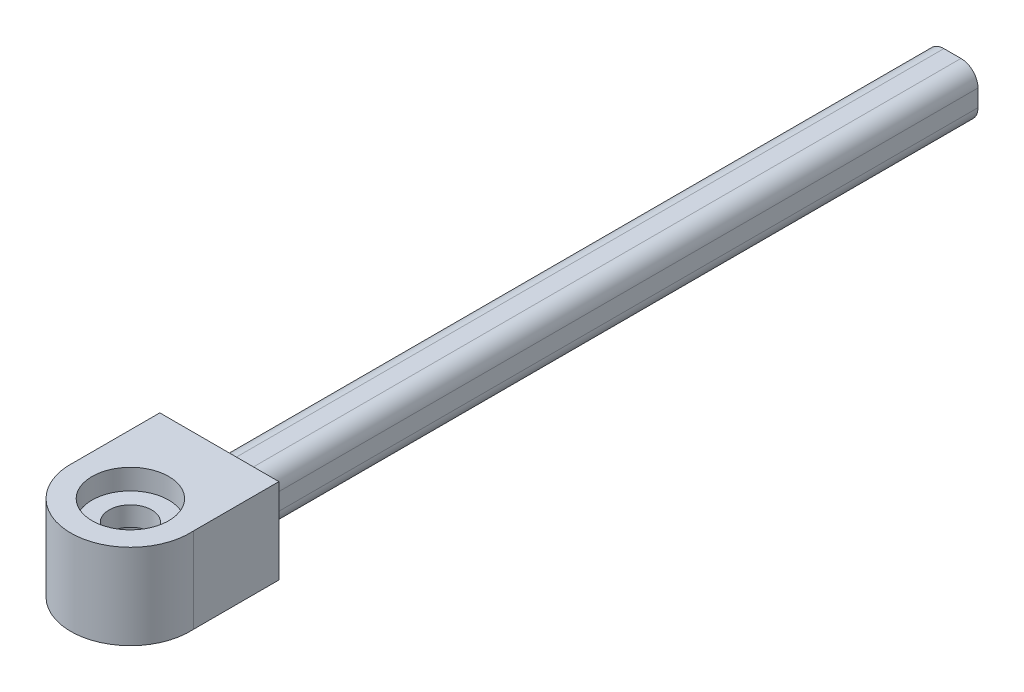
ISO-10303-21;
HEADER;
FILE_DESCRIPTION(('STEP AP214'),'2;1');
FILE_NAME('part.step','',(''),(''),'','','');
FILE_SCHEMA(('AUTOMOTIVE_DESIGN { 1 0 10303 214 1 1 1 1 }'));
ENDSEC;
DATA;
#1=APPLICATION_CONTEXT('core data for automotive mechanical design processes');
#2=APPLICATION_PROTOCOL_DEFINITION('international standard','automotive_design',2000,#1);
#3=PRODUCT_CONTEXT('',#1,'mechanical');
#4=PRODUCT('Part','Part','',(#3));
#5=PRODUCT_RELATED_PRODUCT_CATEGORY('part','',(#4));
#6=PRODUCT_DEFINITION_FORMATION('','',#4);
#7=PRODUCT_DEFINITION_CONTEXT('part definition',#1,'design');
#8=PRODUCT_DEFINITION('design','',#6,#7);
#9=PRODUCT_DEFINITION_SHAPE('','',#8);
#10=(LENGTH_UNIT() NAMED_UNIT(*) SI_UNIT(.MILLI.,.METRE.));
#11=(NAMED_UNIT(*) PLANE_ANGLE_UNIT() SI_UNIT($,.RADIAN.));
#12=(NAMED_UNIT(*) SI_UNIT($,.STERADIAN.) SOLID_ANGLE_UNIT());
#13=UNCERTAINTY_MEASURE_WITH_UNIT(LENGTH_MEASURE(1.E-05),#10,'distance_accuracy_value','');
#14=(GEOMETRIC_REPRESENTATION_CONTEXT(3) GLOBAL_UNCERTAINTY_ASSIGNED_CONTEXT((#13)) GLOBAL_UNIT_ASSIGNED_CONTEXT((#10,
#11,#12)) REPRESENTATION_CONTEXT('',''));
#15=CARTESIAN_POINT('',(0.,0.,0.));
#16=DIRECTION('',(0.,0.,1.));
#17=DIRECTION('',(1.,0.,0.));
#18=AXIS2_PLACEMENT_3D('',#15,#16,#17);
#19=CARTESIAN_POINT('',(3.49315737370935,-8.59119280135186,-5.21875));
#20=DIRECTION('',(0.,0.,1.));
#21=DIRECTION('',(1.,0.,0.));
#22=AXIS2_PLACEMENT_3D('',#19,#20,#21);
#23=PLANE('',#22);
#24=DIRECTION('',(0.,1.,0.));
#25=VECTOR('',#24,1.);
#26=CARTESIAN_POINT('',(3.49315737370935,-8.59119280135186,-5.21875));
#27=LINE('',#26,#25);
#28=CARTESIAN_POINT('',(3.49315737370935,0.,-5.21875));
#29=VERTEX_POINT('',#28);
#30=CARTESIAN_POINT('',(3.49315737370935,5.,-5.21875));
#31=VERTEX_POINT('',#30);
#32=EDGE_CURVE('E123',#29,#31,#27,.T.);
#33=ORIENTED_EDGE('',*,*,#32,.F.);
#34=DIRECTION('',(-1.,0.,0.));
#35=VECTOR('',#34,1.);
#36=CARTESIAN_POINT('',(3.49315737370935,0.,-5.21875));
#37=LINE('',#36,#35);
#38=CARTESIAN_POINT('',(-3.49315737370935,0.,-5.21875));
#39=VERTEX_POINT('',#38);
#40=EDGE_CURVE('E155',#29,#39,#37,.T.);
#41=ORIENTED_EDGE('',*,*,#40,.T.);
#42=DIRECTION('',(0.,1.,0.));
#43=VECTOR('',#42,1.);
#44=CARTESIAN_POINT('',(-3.49315737370935,-8.59119280135186,-5.21875));
#45=LINE('',#44,#43);
#46=CARTESIAN_POINT('',(-3.49315737370935,5.,-5.21875));
#47=VERTEX_POINT('',#46);
#48=EDGE_CURVE('E133',#39,#47,#45,.T.);
#49=ORIENTED_EDGE('',*,*,#48,.T.);
#50=DIRECTION('',(-1.,0.,0.));
#51=VECTOR('',#50,1.);
#52=CARTESIAN_POINT('',(3.49315737370935,5.,-5.21875));
#53=LINE('',#52,#51);
#54=EDGE_CURVE('E141',#31,#47,#53,.T.);
#55=ORIENTED_EDGE('',*,*,#54,.F.);
#56=EDGE_LOOP('',(#33,#41,#49,#55));
#57=FACE_BOUND('',#56,.T.);
#58=DIRECTION('',(0.,1.,0.));
#59=VECTOR('',#58,1.);
#60=CARTESIAN_POINT('',(-1.5,3.5,-5.21875));
#61=LINE('',#60,#59);
#62=CARTESIAN_POINT('',(-1.5,1.5,-5.21875));
#63=VERTEX_POINT('',#62);
#64=CARTESIAN_POINT('',(-1.5,2.5,-5.21875));
#65=VERTEX_POINT('',#64);
#66=EDGE_CURVE('E215',#63,#65,#61,.T.);
#67=ORIENTED_EDGE('',*,*,#66,.F.);
#68=CARTESIAN_POINT('',(-0.5,1.5,-5.21875));
#69=DIRECTION('',(0.,0.,1.));
#70=DIRECTION('',(1.,0.,0.));
#71=AXIS2_PLACEMENT_3D('',#68,#69,#70);
#72=CIRCLE('',#71,1.);
#73=CARTESIAN_POINT('',(-0.5,0.500000000000001,-5.21875));
#74=VERTEX_POINT('',#73);
#75=EDGE_CURVE('E212',#63,#74,#72,.T.);
#76=ORIENTED_EDGE('',*,*,#75,.T.);
#77=DIRECTION('',(-1.,0.,0.));
#78=VECTOR('',#77,1.);
#79=CARTESIAN_POINT('',(1.5,0.500000000000001,-5.21875));
#80=LINE('',#79,#78);
#81=CARTESIAN_POINT('',(0.5,0.500000000000001,-5.21875));
#82=VERTEX_POINT('',#81);
#83=EDGE_CURVE('E146',#82,#74,#80,.T.);
#84=ORIENTED_EDGE('',*,*,#83,.F.);
#85=CARTESIAN_POINT('',(0.5,1.5,-5.21875));
#86=DIRECTION('',(0.,0.,1.));
#87=DIRECTION('',(1.,0.,0.));
#88=AXIS2_PLACEMENT_3D('',#85,#86,#87);
#89=CIRCLE('',#88,1.);
#90=CARTESIAN_POINT('',(1.5,1.5,-5.21875));
#91=VERTEX_POINT('',#90);
#92=EDGE_CURVE('E210',#82,#91,#89,.T.);
#93=ORIENTED_EDGE('',*,*,#92,.T.);
#94=DIRECTION('',(0.,-1.,0.));
#95=VECTOR('',#94,1.);
#96=CARTESIAN_POINT('',(1.5,3.5,-5.21875));
#97=LINE('',#96,#95);
#98=CARTESIAN_POINT('',(1.5,2.5,-5.21875));
#99=VERTEX_POINT('',#98);
#100=EDGE_CURVE('E245',#99,#91,#97,.T.);
#101=ORIENTED_EDGE('',*,*,#100,.F.);
#102=CARTESIAN_POINT('',(0.5,2.5,-5.21875));
#103=DIRECTION('',(0.,0.,1.));
#104=DIRECTION('',(1.,0.,0.));
#105=AXIS2_PLACEMENT_3D('',#102,#103,#104);
#106=CIRCLE('',#105,1.);
#107=CARTESIAN_POINT('',(0.5,3.5,-5.21875));
#108=VERTEX_POINT('',#107);
#109=EDGE_CURVE('E11',#99,#108,#106,.T.);
#110=ORIENTED_EDGE('',*,*,#109,.T.);
#111=DIRECTION('',(1.,0.,0.));
#112=VECTOR('',#111,1.);
#113=CARTESIAN_POINT('',(1.5,3.5,-5.21875));
#114=LINE('',#113,#112);
#115=CARTESIAN_POINT('',(-0.5,3.5,-5.21875));
#116=VERTEX_POINT('',#115);
#117=EDGE_CURVE('E216',#116,#108,#114,.T.);
#118=ORIENTED_EDGE('',*,*,#117,.F.);
#119=CARTESIAN_POINT('',(-0.5,2.5,-5.21875));
#120=DIRECTION('',(0.,0.,1.));
#121=DIRECTION('',(1.,0.,0.));
#122=AXIS2_PLACEMENT_3D('',#119,#120,#121);
#123=CIRCLE('',#122,1.);
#124=EDGE_CURVE('E42',#116,#65,#123,.T.);
#125=ORIENTED_EDGE('',*,*,#124,.T.);
#126=EDGE_LOOP('',(#67,#76,#84,#93,#101,#110,#118,#125));
#127=FACE_BOUND('',#126,.T.);
#128=ADVANCED_FACE('F34',(#57,#127),#23,.F.);
#129=CARTESIAN_POINT('',(0.,0.,0.));
#130=DIRECTION('',(0.,-1.,0.));
#131=DIRECTION('',(0.,0.,-1.));
#132=AXIS2_PLACEMENT_3D('',#129,#130,#131);
#133=CYLINDRICAL_SURFACE('',#132,3.5);
#134=CARTESIAN_POINT('',(0.,5.,0.));
#135=DIRECTION('',(0.,-1.,0.));
#136=DIRECTION('',(0.,0.,-1.));
#137=AXIS2_PLACEMENT_3D('',#134,#135,#136);
#138=CIRCLE('',#137,3.5);
#139=CARTESIAN_POINT('',(3.49315737370935,5.,-0.21875));
#140=VERTEX_POINT('',#139);
#141=CARTESIAN_POINT('',(-3.49315737370935,5.,-0.218749999999998));
#142=VERTEX_POINT('',#141);
#143=EDGE_CURVE('E144',#140,#142,#138,.T.);
#144=ORIENTED_EDGE('',*,*,#143,.T.);
#145=DIRECTION('',(0.,1.,0.));
#146=VECTOR('',#145,1.);
#147=CARTESIAN_POINT('',(-3.49315737370935,-8.59119280135186,-0.218749999999998));
#148=LINE('',#147,#146);
#149=CARTESIAN_POINT('',(-3.49315737370935,0.,-0.218749999999998));
#150=VERTEX_POINT('',#149);
#151=EDGE_CURVE('E149',#150,#142,#148,.T.);
#152=ORIENTED_EDGE('',*,*,#151,.F.);
#153=CARTESIAN_POINT('',(0.,0.,0.));
#154=DIRECTION('',(0.,-1.,0.));
#155=DIRECTION('',(0.,0.,-1.));
#156=AXIS2_PLACEMENT_3D('',#153,#154,#155);
#157=CIRCLE('',#156,3.5);
#158=CARTESIAN_POINT('',(3.49315737370935,0.,-0.21875000000002));
#159=VERTEX_POINT('',#158);
#160=EDGE_CURVE('E177',#159,#150,#157,.T.);
#161=ORIENTED_EDGE('',*,*,#160,.F.);
#162=DIRECTION('',(0.,1.,0.));
#163=VECTOR('',#162,1.);
#164=CARTESIAN_POINT('',(3.49315737370935,-8.59119280135186,-0.21875));
#165=LINE('',#164,#163);
#166=EDGE_CURVE('E134',#159,#140,#165,.T.);
#167=ORIENTED_EDGE('',*,*,#166,.T.);
#168=EDGE_LOOP('',(#144,#152,#161,#167));
#169=FACE_BOUND('',#168,.T.);
#170=ADVANCED_FACE('F272',(#169),#133,.T.);
#171=CARTESIAN_POINT('',(0.,0.,0.));
#172=DIRECTION('',(0.,-1.,0.));
#173=DIRECTION('',(0.,0.,-1.));
#174=AXIS2_PLACEMENT_3D('',#171,#172,#173);
#175=CYLINDRICAL_SURFACE('',#174,2.4);
#176=CARTESIAN_POINT('',(0.,2.66,0.));
#177=DIRECTION('',(0.,-1.,0.));
#178=DIRECTION('',(0.,0.,-1.));
#179=AXIS2_PLACEMENT_3D('',#176,#177,#178);
#180=CIRCLE('',#179,2.4);
#181=CARTESIAN_POINT('',(0.,2.66,-2.4));
#182=VERTEX_POINT('',#181);
#183=EDGE_CURVE('E158',#182,#182,#180,.T.);
#184=ORIENTED_EDGE('',*,*,#183,.F.);
#185=EDGE_LOOP('',(#184));
#186=FACE_BOUND('',#185,.T.);
#187=CARTESIAN_POINT('',(0.,0.,0.));
#188=DIRECTION('',(0.,-1.,0.));
#189=DIRECTION('',(0.,0.,-1.));
#190=AXIS2_PLACEMENT_3D('',#187,#188,#189);
#191=CIRCLE('',#190,2.4);
#192=CARTESIAN_POINT('',(0.,0.,-2.4));
#193=VERTEX_POINT('',#192);
#194=EDGE_CURVE('E180',#193,#193,#191,.T.);
#195=ORIENTED_EDGE('',*,*,#194,.T.);
#196=EDGE_LOOP('',(#195));
#197=FACE_BOUND('',#196,.T.);
#198=ADVANCED_FACE('F277',(#186,#197),#175,.F.);
#199=CARTESIAN_POINT('',(-2.4,0.,0.));
#200=DIRECTION('',(0.,1.,0.));
#201=DIRECTION('',(0.,0.,1.));
#202=AXIS2_PLACEMENT_3D('',#199,#200,#201);
#203=PLANE('',#202);
#204=ORIENTED_EDGE('',*,*,#194,.F.);
#205=EDGE_LOOP('',(#204));
#206=FACE_BOUND('',#205,.T.);
#207=ORIENTED_EDGE('',*,*,#160,.T.);
#208=DIRECTION('',(0.,0.,1.));
#209=VECTOR('',#208,1.);
#210=CARTESIAN_POINT('',(-3.49315737370935,0.,-5.21875));
#211=LINE('',#210,#209);
#212=EDGE_CURVE('E157',#39,#150,#211,.T.);
#213=ORIENTED_EDGE('',*,*,#212,.F.);
#214=ORIENTED_EDGE('',*,*,#40,.F.);
#215=DIRECTION('',(0.,0.,-1.));
#216=VECTOR('',#215,1.);
#217=CARTESIAN_POINT('',(3.49315737370935,0.,-0.21875));
#218=LINE('',#217,#216);
#219=EDGE_CURVE('E129',#159,#29,#218,.T.);
#220=ORIENTED_EDGE('',*,*,#219,.F.);
#221=EDGE_LOOP('',(#207,#213,#214,#220));
#222=FACE_BOUND('',#221,.T.);
#223=ADVANCED_FACE('F304',(#206,#222),#203,.F.);
#224=CARTESIAN_POINT('',(-3.5,5.,0.));
#225=DIRECTION('',(0.,-1.,0.));
#226=DIRECTION('',(0.,0.,-1.));
#227=AXIS2_PLACEMENT_3D('',#224,#225,#226);
#228=PLANE('',#227);
#229=ORIENTED_EDGE('',*,*,#143,.F.);
#230=DIRECTION('',(0.,0.,-1.));
#231=VECTOR('',#230,1.);
#232=CARTESIAN_POINT('',(3.49315737370935,5.,-0.21875));
#233=LINE('',#232,#231);
#234=EDGE_CURVE('E126',#140,#31,#233,.T.);
#235=ORIENTED_EDGE('',*,*,#234,.T.);
#236=ORIENTED_EDGE('',*,*,#54,.T.);
#237=DIRECTION('',(0.,0.,1.));
#238=VECTOR('',#237,1.);
#239=CARTESIAN_POINT('',(-3.49315737370935,5.,-5.21875));
#240=LINE('',#239,#238);
#241=EDGE_CURVE('E145',#47,#142,#240,.T.);
#242=ORIENTED_EDGE('',*,*,#241,.T.);
#243=EDGE_LOOP('',(#229,#235,#236,#242));
#244=FACE_BOUND('',#243,.T.);
#245=CARTESIAN_POINT('',(0.,5.,0.));
#246=DIRECTION('',(0.,-1.,0.));
#247=DIRECTION('',(0.,0.,-1.));
#248=AXIS2_PLACEMENT_3D('',#245,#246,#247);
#249=CIRCLE('',#248,2.25);
#250=CARTESIAN_POINT('',(0.,5.,-2.25));
#251=VERTEX_POINT('',#250);
#252=EDGE_CURVE('E173',#251,#251,#249,.T.);
#253=ORIENTED_EDGE('',*,*,#252,.T.);
#254=EDGE_LOOP('',(#253));
#255=FACE_BOUND('',#254,.T.);
#256=ADVANCED_FACE('F138',(#244,#255),#228,.F.);
#257=CARTESIAN_POINT('',(0.,0.,0.));
#258=DIRECTION('',(0.,-1.,0.));
#259=DIRECTION('',(0.,0.,-1.));
#260=AXIS2_PLACEMENT_3D('',#257,#258,#259);
#261=CYLINDRICAL_SURFACE('',#260,2.25);
#262=ORIENTED_EDGE('',*,*,#252,.F.);
#263=EDGE_LOOP('',(#262));
#264=FACE_BOUND('',#263,.T.);
#265=CARTESIAN_POINT('',(0.,3.8,0.));
#266=DIRECTION('',(0.,-1.,0.));
#267=DIRECTION('',(0.,0.,-1.));
#268=AXIS2_PLACEMENT_3D('',#265,#266,#267);
#269=CIRCLE('',#268,2.25);
#270=CARTESIAN_POINT('',(0.,3.8,-2.25));
#271=VERTEX_POINT('',#270);
#272=EDGE_CURVE('E170',#271,#271,#269,.T.);
#273=ORIENTED_EDGE('',*,*,#272,.T.);
#274=EDGE_LOOP('',(#273));
#275=FACE_BOUND('',#274,.T.);
#276=ADVANCED_FACE('F298',(#264,#275),#261,.F.);
#277=CARTESIAN_POINT('',(-2.25,3.8,0.));
#278=DIRECTION('',(0.,-1.,0.));
#279=DIRECTION('',(0.,0.,-1.));
#280=AXIS2_PLACEMENT_3D('',#277,#278,#279);
#281=PLANE('',#280);
#282=ORIENTED_EDGE('',*,*,#272,.F.);
#283=EDGE_LOOP('',(#282));
#284=FACE_BOUND('',#283,.T.);
#285=CARTESIAN_POINT('',(0.,3.8,0.));
#286=DIRECTION('',(0.,-1.,0.));
#287=DIRECTION('',(0.,0.,-1.));
#288=AXIS2_PLACEMENT_3D('',#285,#286,#287);
#289=CIRCLE('',#288,1.25);
#290=CARTESIAN_POINT('',(0.,3.8,-1.25));
#291=VERTEX_POINT('',#290);
#292=EDGE_CURVE('E167',#291,#291,#289,.T.);
#293=ORIENTED_EDGE('',*,*,#292,.T.);
#294=EDGE_LOOP('',(#293));
#295=FACE_BOUND('',#294,.T.);
#296=ADVANCED_FACE('F294',(#284,#295),#281,.F.);
#297=CARTESIAN_POINT('',(0.,0.,0.));
#298=DIRECTION('',(0.,-1.,0.));
#299=DIRECTION('',(0.,0.,-1.));
#300=AXIS2_PLACEMENT_3D('',#297,#298,#299);
#301=CYLINDRICAL_SURFACE('',#300,1.25);
#302=ORIENTED_EDGE('',*,*,#292,.F.);
#303=EDGE_LOOP('',(#302));
#304=FACE_BOUND('',#303,.T.);
#305=CARTESIAN_POINT('',(0.,2.66,0.));
#306=DIRECTION('',(0.,-1.,0.));
#307=DIRECTION('',(0.,0.,-1.));
#308=AXIS2_PLACEMENT_3D('',#305,#306,#307);
#309=CIRCLE('',#308,1.25);
#310=CARTESIAN_POINT('',(0.,2.66,-1.25));
#311=VERTEX_POINT('',#310);
#312=EDGE_CURVE('E164',#311,#311,#309,.T.);
#313=ORIENTED_EDGE('',*,*,#312,.T.);
#314=EDGE_LOOP('',(#313));
#315=FACE_BOUND('',#314,.T.);
#316=ADVANCED_FACE('F290',(#304,#315),#301,.F.);
#317=CARTESIAN_POINT('',(-1.25,2.66,0.));
#318=DIRECTION('',(0.,1.,0.));
#319=DIRECTION('',(0.,0.,1.));
#320=AXIS2_PLACEMENT_3D('',#317,#318,#319);
#321=PLANE('',#320);
#322=ORIENTED_EDGE('',*,*,#312,.F.);
#323=EDGE_LOOP('',(#322));
#324=FACE_BOUND('',#323,.T.);
#325=ORIENTED_EDGE('',*,*,#183,.T.);
#326=EDGE_LOOP('',(#325));
#327=FACE_BOUND('',#326,.T.);
#328=ADVANCED_FACE('F287',(#324,#327),#321,.F.);
#329=CARTESIAN_POINT('',(3.49315737370935,-8.59119280135186,-0.21875));
#330=DIRECTION('',(-1.,0.,0.));
#331=DIRECTION('',(0.,0.,1.));
#332=AXIS2_PLACEMENT_3D('',#329,#330,#331);
#333=PLANE('',#332);
#334=ORIENTED_EDGE('',*,*,#166,.F.);
#335=ORIENTED_EDGE('',*,*,#219,.T.);
#336=ORIENTED_EDGE('',*,*,#32,.T.);
#337=ORIENTED_EDGE('',*,*,#234,.F.);
#338=EDGE_LOOP('',(#334,#335,#336,#337));
#339=FACE_BOUND('',#338,.T.);
#340=ADVANCED_FACE('F125',(#339),#333,.F.);
#341=CARTESIAN_POINT('',(-3.49315737370935,-8.59119280135186,-5.21875));
#342=DIRECTION('',(1.,0.,0.));
#343=DIRECTION('',(0.,0.,-1.));
#344=AXIS2_PLACEMENT_3D('',#341,#342,#343);
#345=PLANE('',#344);
#346=ORIENTED_EDGE('',*,*,#48,.F.);
#347=ORIENTED_EDGE('',*,*,#212,.T.);
#348=ORIENTED_EDGE('',*,*,#151,.T.);
#349=ORIENTED_EDGE('',*,*,#241,.F.);
#350=EDGE_LOOP('',(#346,#347,#348,#349));
#351=FACE_BOUND('',#350,.T.);
#352=ADVANCED_FACE('F283',(#351),#345,.F.);
#353=CARTESIAN_POINT('',(-1.5,3.5,-45.21875));
#354=DIRECTION('',(1.,0.,0.));
#355=DIRECTION('',(0.,0.,-1.));
#356=AXIS2_PLACEMENT_3D('',#353,#354,#355);
#357=PLANE('',#356);
#358=DIRECTION('',(0.,1.,0.));
#359=VECTOR('',#358,1.);
#360=CARTESIAN_POINT('',(-1.5,0.500000000000001,-48.21875));
#361=LINE('',#360,#359);
#362=CARTESIAN_POINT('',(-1.5,1.5,-48.21875));
#363=VERTEX_POINT('',#362);
#364=CARTESIAN_POINT('',(-1.5,2.5,-48.21875));
#365=VERTEX_POINT('',#364);
#366=EDGE_CURVE('E222',#363,#365,#361,.T.);
#367=ORIENTED_EDGE('',*,*,#366,.F.);
#368=DIRECTION('',(0.,0.,1.));
#369=VECTOR('',#368,1.);
#370=CARTESIAN_POINT('',(-1.5,1.5,-45.21875));
#371=LINE('',#370,#369);
#372=EDGE_CURVE('E203',#363,#63,#371,.T.);
#373=ORIENTED_EDGE('',*,*,#372,.T.);
#374=ORIENTED_EDGE('',*,*,#66,.T.);
#375=DIRECTION('',(0.,0.,1.));
#376=VECTOR('',#375,1.);
#377=CARTESIAN_POINT('',(-1.5,2.5,-45.21875));
#378=LINE('',#377,#376);
#379=EDGE_CURVE('E201',#65,#365,#378,.F.);
#380=ORIENTED_EDGE('',*,*,#379,.T.);
#381=EDGE_LOOP('',(#367,#373,#374,#380));
#382=FACE_BOUND('',#381,.T.);
#383=ADVANCED_FACE('F219',(#382),#357,.F.);
#384=CARTESIAN_POINT('',(1.5,3.5,-45.21875));
#385=DIRECTION('',(0.,-1.,0.));
#386=DIRECTION('',(0.,0.,-1.));
#387=AXIS2_PLACEMENT_3D('',#384,#385,#386);
#388=PLANE('',#387);
#389=DIRECTION('',(1.,0.,0.));
#390=VECTOR('',#389,1.);
#391=CARTESIAN_POINT('',(-1.5,3.5,-48.21875));
#392=LINE('',#391,#390);
#393=CARTESIAN_POINT('',(-0.5,3.5,-48.21875));
#394=VERTEX_POINT('',#393);
#395=CARTESIAN_POINT('',(0.5,3.5,-48.21875));
#396=VERTEX_POINT('',#395);
#397=EDGE_CURVE('E231',#394,#396,#392,.T.);
#398=ORIENTED_EDGE('',*,*,#397,.F.);
#399=DIRECTION('',(0.,0.,1.));
#400=VECTOR('',#399,1.);
#401=CARTESIAN_POINT('',(-0.5,3.5,-45.21875));
#402=LINE('',#401,#400);
#403=EDGE_CURVE('E208',#394,#116,#402,.T.);
#404=ORIENTED_EDGE('',*,*,#403,.T.);
#405=ORIENTED_EDGE('',*,*,#117,.T.);
#406=DIRECTION('',(0.,0.,1.));
#407=VECTOR('',#406,1.);
#408=CARTESIAN_POINT('',(0.5,3.5,-45.21875));
#409=LINE('',#408,#407);
#410=EDGE_CURVE('E206',#108,#396,#409,.F.);
#411=ORIENTED_EDGE('',*,*,#410,.T.);
#412=EDGE_LOOP('',(#398,#404,#405,#411));
#413=FACE_BOUND('',#412,.T.);
#414=ADVANCED_FACE('F234',(#413),#388,.F.);
#415=CARTESIAN_POINT('',(1.5,3.5,-45.21875));
#416=DIRECTION('',(-1.,0.,0.));
#417=DIRECTION('',(0.,-1.,0.));
#418=AXIS2_PLACEMENT_3D('',#415,#416,#417);
#419=PLANE('',#418);
#420=ORIENTED_EDGE('',*,*,#100,.T.);
#421=DIRECTION('',(0.,0.,1.));
#422=VECTOR('',#421,1.);
#423=CARTESIAN_POINT('',(1.5,1.5,-45.21875));
#424=LINE('',#423,#422);
#425=CARTESIAN_POINT('',(1.5,1.5,-48.21875));
#426=VERTEX_POINT('',#425);
#427=EDGE_CURVE('E191',#91,#426,#424,.F.);
#428=ORIENTED_EDGE('',*,*,#427,.T.);
#429=DIRECTION('',(0.,-1.,0.));
#430=VECTOR('',#429,1.);
#431=CARTESIAN_POINT('',(1.5,3.5,-48.21875));
#432=LINE('',#431,#430);
#433=CARTESIAN_POINT('',(1.5,2.5,-48.21875));
#434=VERTEX_POINT('',#433);
#435=EDGE_CURVE('E236',#434,#426,#432,.T.);
#436=ORIENTED_EDGE('',*,*,#435,.F.);
#437=DIRECTION('',(0.,0.,1.));
#438=VECTOR('',#437,1.);
#439=CARTESIAN_POINT('',(1.5,2.5,-45.21875));
#440=LINE('',#439,#438);
#441=EDGE_CURVE('E188',#434,#99,#440,.T.);
#442=ORIENTED_EDGE('',*,*,#441,.T.);
#443=EDGE_LOOP('',(#420,#428,#436,#442));
#444=FACE_BOUND('',#443,.T.);
#445=ADVANCED_FACE('F263',(#444),#419,.F.);
#446=CARTESIAN_POINT('',(1.5,0.500000000000001,-45.21875));
#447=DIRECTION('',(0.,1.,0.));
#448=DIRECTION('',(-1.,0.,0.));
#449=AXIS2_PLACEMENT_3D('',#446,#447,#448);
#450=PLANE('',#449);
#451=DIRECTION('',(-1.,0.,0.));
#452=VECTOR('',#451,1.);
#453=CARTESIAN_POINT('',(1.5,0.500000000000001,-48.21875));
#454=LINE('',#453,#452);
#455=CARTESIAN_POINT('',(0.5,0.500000000000001,-48.21875));
#456=VERTEX_POINT('',#455);
#457=CARTESIAN_POINT('',(-0.5,0.500000000000001,-48.21875));
#458=VERTEX_POINT('',#457);
#459=EDGE_CURVE('E238',#456,#458,#454,.T.);
#460=ORIENTED_EDGE('',*,*,#459,.F.);
#461=DIRECTION('',(0.,0.,1.));
#462=VECTOR('',#461,1.);
#463=CARTESIAN_POINT('',(0.5,0.500000000000001,-45.21875));
#464=LINE('',#463,#462);
#465=EDGE_CURVE('E185',#456,#82,#464,.T.);
#466=ORIENTED_EDGE('',*,*,#465,.T.);
#467=ORIENTED_EDGE('',*,*,#83,.T.);
#468=DIRECTION('',(0.,0.,1.));
#469=VECTOR('',#468,1.);
#470=CARTESIAN_POINT('',(-0.5,0.500000000000001,-45.21875));
#471=LINE('',#470,#469);
#472=EDGE_CURVE('E183',#74,#458,#471,.F.);
#473=ORIENTED_EDGE('',*,*,#472,.T.);
#474=EDGE_LOOP('',(#460,#466,#467,#473));
#475=FACE_BOUND('',#474,.T.);
#476=ADVANCED_FACE('F253',(#475),#450,.F.);
#477=CARTESIAN_POINT('',(0.,0.,-48.21875));
#478=DIRECTION('',(0.,0.,-1.));
#479=DIRECTION('',(-1.,0.,0.));
#480=AXIS2_PLACEMENT_3D('',#477,#478,#479);
#481=PLANE('',#480);
#482=ORIENTED_EDGE('',*,*,#435,.T.);
#483=CARTESIAN_POINT('',(0.5,1.5,-48.21875));
#484=DIRECTION('',(0.,0.,-1.));
#485=DIRECTION('',(-1.,0.,0.));
#486=AXIS2_PLACEMENT_3D('',#483,#484,#485);
#487=CIRCLE('',#486,1.);
#488=EDGE_CURVE('E199',#426,#456,#487,.T.);
#489=ORIENTED_EDGE('',*,*,#488,.T.);
#490=ORIENTED_EDGE('',*,*,#459,.T.);
#491=CARTESIAN_POINT('',(-0.5,1.5,-48.21875));
#492=DIRECTION('',(0.,0.,-1.));
#493=DIRECTION('',(-1.,0.,0.));
#494=AXIS2_PLACEMENT_3D('',#491,#492,#493);
#495=CIRCLE('',#494,1.);
#496=EDGE_CURVE('E197',#458,#363,#495,.T.);
#497=ORIENTED_EDGE('',*,*,#496,.T.);
#498=ORIENTED_EDGE('',*,*,#366,.T.);
#499=CARTESIAN_POINT('',(-0.5,2.5,-48.21875));
#500=DIRECTION('',(0.,0.,-1.));
#501=DIRECTION('',(-1.,0.,0.));
#502=AXIS2_PLACEMENT_3D('',#499,#500,#501);
#503=CIRCLE('',#502,1.);
#504=EDGE_CURVE('E195',#365,#394,#503,.T.);
#505=ORIENTED_EDGE('',*,*,#504,.T.);
#506=ORIENTED_EDGE('',*,*,#397,.T.);
#507=CARTESIAN_POINT('',(0.5,2.5,-48.21875));
#508=DIRECTION('',(0.,0.,-1.));
#509=DIRECTION('',(-1.,0.,0.));
#510=AXIS2_PLACEMENT_3D('',#507,#508,#509);
#511=CIRCLE('',#510,1.);
#512=EDGE_CURVE('E193',#396,#434,#511,.T.);
#513=ORIENTED_EDGE('',*,*,#512,.T.);
#514=EDGE_LOOP('',(#482,#489,#490,#497,#498,#505,#506,#513));
#515=FACE_BOUND('',#514,.T.);
#516=ADVANCED_FACE('F230',(#515),#481,.T.);
#517=CARTESIAN_POINT('',(0.5,1.5,-45.21875));
#518=DIRECTION('',(0.,0.,1.));
#519=DIRECTION('',(1.,0.,0.));
#520=AXIS2_PLACEMENT_3D('',#517,#518,#519);
#521=CYLINDRICAL_SURFACE('',#520,1.);
#522=ORIENTED_EDGE('',*,*,#488,.F.);
#523=ORIENTED_EDGE('',*,*,#427,.F.);
#524=ORIENTED_EDGE('',*,*,#92,.F.);
#525=ORIENTED_EDGE('',*,*,#465,.F.);
#526=EDGE_LOOP('',(#522,#523,#524,#525));
#527=FACE_BOUND('',#526,.T.);
#528=ADVANCED_FACE('F260',(#527),#521,.T.);
#529=CARTESIAN_POINT('',(-0.5,1.5,-45.21875));
#530=DIRECTION('',(0.,0.,1.));
#531=DIRECTION('',(1.,0.,0.));
#532=AXIS2_PLACEMENT_3D('',#529,#530,#531);
#533=CYLINDRICAL_SURFACE('',#532,1.);
#534=ORIENTED_EDGE('',*,*,#496,.F.);
#535=ORIENTED_EDGE('',*,*,#472,.F.);
#536=ORIENTED_EDGE('',*,*,#75,.F.);
#537=ORIENTED_EDGE('',*,*,#372,.F.);
#538=EDGE_LOOP('',(#534,#535,#536,#537));
#539=FACE_BOUND('',#538,.T.);
#540=ADVANCED_FACE('F257',(#539),#533,.T.);
#541=CARTESIAN_POINT('',(-0.5,2.5,-45.21875));
#542=DIRECTION('',(0.,0.,1.));
#543=DIRECTION('',(1.,0.,0.));
#544=AXIS2_PLACEMENT_3D('',#541,#542,#543);
#545=CYLINDRICAL_SURFACE('',#544,1.);
#546=ORIENTED_EDGE('',*,*,#504,.F.);
#547=ORIENTED_EDGE('',*,*,#379,.F.);
#548=ORIENTED_EDGE('',*,*,#124,.F.);
#549=ORIENTED_EDGE('',*,*,#403,.F.);
#550=EDGE_LOOP('',(#546,#547,#548,#549));
#551=FACE_BOUND('',#550,.T.);
#552=ADVANCED_FACE('F225',(#551),#545,.T.);
#553=CARTESIAN_POINT('',(0.5,2.5,-45.21875));
#554=DIRECTION('',(0.,0.,1.));
#555=DIRECTION('',(1.,0.,0.));
#556=AXIS2_PLACEMENT_3D('',#553,#554,#555);
#557=CYLINDRICAL_SURFACE('',#556,1.);
#558=ORIENTED_EDGE('',*,*,#512,.F.);
#559=ORIENTED_EDGE('',*,*,#410,.F.);
#560=ORIENTED_EDGE('',*,*,#109,.F.);
#561=ORIENTED_EDGE('',*,*,#441,.F.);
#562=EDGE_LOOP('',(#558,#559,#560,#561));
#563=FACE_BOUND('',#562,.T.);
#564=ADVANCED_FACE('F36',(#563),#557,.T.);
#565=CLOSED_SHELL('',(#128,#170,#198,#223,#256,#276,#296,#316,#328,#340,#352,#383,#414,#445,
#476,#516,#528,#540,#552,#564));
#566=MANIFOLD_SOLID_BREP('B2',#565);
#567=ADVANCED_BREP_SHAPE_REPRESENTATION('',(#18,#566),#14);
#568=SHAPE_DEFINITION_REPRESENTATION(#9,#567);
ENDSEC;
END-ISO-10303-21;
